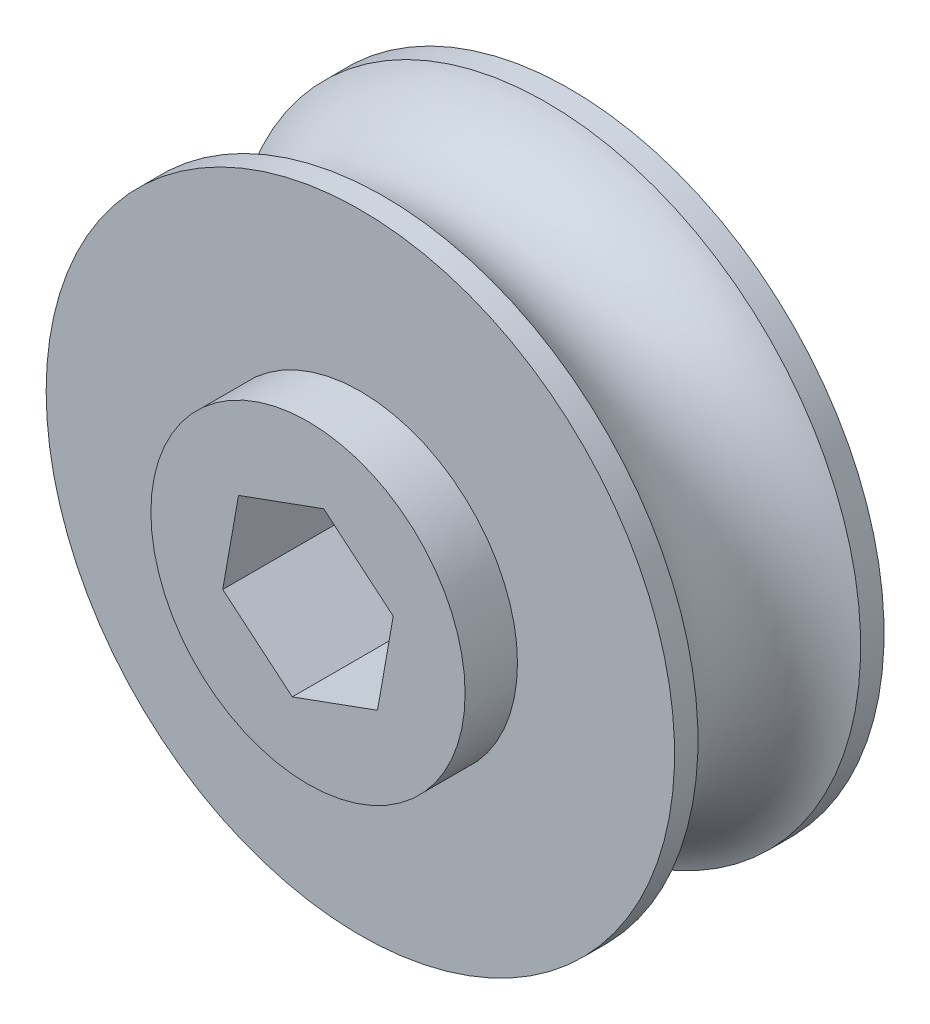
ISO-10303-21;
HEADER;
FILE_DESCRIPTION(('STEP AP214'),'2;1');
FILE_NAME('part.step','',(''),(''),'','','');
FILE_SCHEMA(('AUTOMOTIVE_DESIGN { 1 0 10303 214 1 1 1 1 }'));
ENDSEC;
DATA;
#1=APPLICATION_CONTEXT('core data for automotive mechanical design processes');
#2=APPLICATION_PROTOCOL_DEFINITION('international standard','automotive_design',2000,#1);
#3=PRODUCT_CONTEXT('',#1,'mechanical');
#4=PRODUCT('Part','Part','',(#3));
#5=PRODUCT_RELATED_PRODUCT_CATEGORY('part','',(#4));
#6=PRODUCT_DEFINITION_FORMATION('','',#4);
#7=PRODUCT_DEFINITION_CONTEXT('part definition',#1,'design');
#8=PRODUCT_DEFINITION('design','',#6,#7);
#9=PRODUCT_DEFINITION_SHAPE('','',#8);
#10=(LENGTH_UNIT() NAMED_UNIT(*) SI_UNIT(.MILLI.,.METRE.));
#11=(NAMED_UNIT(*) PLANE_ANGLE_UNIT() SI_UNIT($,.RADIAN.));
#12=(NAMED_UNIT(*) SI_UNIT($,.STERADIAN.) SOLID_ANGLE_UNIT());
#13=UNCERTAINTY_MEASURE_WITH_UNIT(LENGTH_MEASURE(1.E-05),#10,'distance_accuracy_value','');
#14=(GEOMETRIC_REPRESENTATION_CONTEXT(3) GLOBAL_UNCERTAINTY_ASSIGNED_CONTEXT((#13)) GLOBAL_UNIT_ASSIGNED_CONTEXT((#10,
#11,#12)) REPRESENTATION_CONTEXT('',''));
#15=CARTESIAN_POINT('',(0.,0.,0.));
#16=DIRECTION('',(0.,0.,1.));
#17=DIRECTION('',(1.,0.,0.));
#18=AXIS2_PLACEMENT_3D('',#15,#16,#17);
#19=CARTESIAN_POINT('',(0.,0.,15.875));
#20=DIRECTION('',(0.,0.,1.));
#21=DIRECTION('',(1.,0.,0.));
#22=AXIS2_PLACEMENT_3D('',#19,#20,#21);
#23=PLANE('',#22);
#24=DIRECTION('',(-0.173570076525815,-0.984821521157424,0.));
#25=VECTOR('',#24,1.);
#26=CARTESIAN_POINT('',(-5.16746609806817,-1.88126795680899,15.875));
#27=LINE('',#26,#25);
#28=CARTESIAN_POINT('',(-5.16746609806816,-1.88126795680899,15.875));
#29=VERTEX_POINT('',#28);
#30=CARTESIAN_POINT('',(-4.21295889095631,3.53452293571739,15.875));
#31=VERTEX_POINT('',#30);
#32=EDGE_CURVE('E116',#29,#31,#27,.F.);
#33=ORIENTED_EDGE('',*,*,#32,.T.);
#34=DIRECTION('',(-0.939665493778871,-0.342094664970547,0.));
#35=VECTOR('',#34,1.);
#36=CARTESIAN_POINT('',(-4.2129588909563,3.53452293571738,15.875));
#37=LINE('',#36,#35);
#38=CARTESIAN_POINT('',(0.954507207111848,5.41579089252637,15.875));
#39=VERTEX_POINT('',#38);
#40=EDGE_CURVE('E111',#31,#39,#37,.F.);
#41=ORIENTED_EDGE('',*,*,#40,.T.);
#42=DIRECTION('',(-0.766095417253056,0.642726856186877,0.));
#43=VECTOR('',#42,1.);
#44=CARTESIAN_POINT('',(0.954507207111846,5.41579089252637,15.875));
#45=LINE('',#44,#43);
#46=CARTESIAN_POINT('',(5.16746609806817,1.88126795680899,15.875));
#47=VERTEX_POINT('',#46);
#48=EDGE_CURVE('E73',#39,#47,#45,.F.);
#49=ORIENTED_EDGE('',*,*,#48,.T.);
#50=DIRECTION('',(0.173570076525816,0.984821521157424,0.));
#51=VECTOR('',#50,1.);
#52=CARTESIAN_POINT('',(5.16746609806817,1.88126795680899,15.875));
#53=LINE('',#52,#51);
#54=CARTESIAN_POINT('',(4.2129588909563,-3.53452293571739,15.875));
#55=VERTEX_POINT('',#54);
#56=EDGE_CURVE('E71',#47,#55,#53,.F.);
#57=ORIENTED_EDGE('',*,*,#56,.T.);
#58=DIRECTION('',(0.939665493778871,0.342094664970547,0.));
#59=VECTOR('',#58,1.);
#60=CARTESIAN_POINT('',(4.2129588909563,-3.53452293571738,15.875));
#61=LINE('',#60,#59);
#62=CARTESIAN_POINT('',(-0.95450720711185,-5.41579089252637,15.875));
#63=VERTEX_POINT('',#62);
#64=EDGE_CURVE('E68',#55,#63,#61,.F.);
#65=ORIENTED_EDGE('',*,*,#64,.T.);
#66=DIRECTION('',(0.766095417253055,-0.642726856186877,0.));
#67=VECTOR('',#66,1.);
#68=CARTESIAN_POINT('',(-0.954507207111849,-5.41579089252637,15.875));
#69=LINE('',#68,#67);
#70=EDGE_CURVE('E121',#63,#29,#69,.F.);
#71=ORIENTED_EDGE('',*,*,#70,.T.);
#72=EDGE_LOOP('',(#33,#41,#49,#57,#65,#71));
#73=FACE_BOUND('',#72,.T.);
#74=CARTESIAN_POINT('',(0.,0.,15.875));
#75=DIRECTION('',(0.,0.,-1.));
#76=DIRECTION('',(-1.,0.,0.));
#77=AXIS2_PLACEMENT_3D('',#74,#75,#76);
#78=CIRCLE('',#77,9.525);
#79=CARTESIAN_POINT('',(-9.525,0.,15.875));
#80=VERTEX_POINT('',#79);
#81=EDGE_CURVE('E20',#80,#80,#78,.T.);
#82=ORIENTED_EDGE('',*,*,#81,.F.);
#83=EDGE_LOOP('',(#82));
#84=FACE_BOUND('',#83,.T.);
#85=ADVANCED_FACE('F17',(#73,#84),#23,.T.);
#86=CARTESIAN_POINT('',(0.,0.,15.875));
#87=DIRECTION('',(0.,0.,-1.));
#88=DIRECTION('',(-1.,0.,0.));
#89=AXIS2_PLACEMENT_3D('',#86,#87,#88);
#90=CYLINDRICAL_SURFACE('',#89,9.525);
#91=CARTESIAN_POINT('',(0.,0.,12.7));
#92=DIRECTION('',(0.,0.,-1.));
#93=DIRECTION('',(-1.,0.,0.));
#94=AXIS2_PLACEMENT_3D('',#91,#92,#93);
#95=CIRCLE('',#94,9.525);
#96=CARTESIAN_POINT('',(-9.525,0.,12.7));
#97=VERTEX_POINT('',#96);
#98=EDGE_CURVE('E99',#97,#97,#95,.T.);
#99=ORIENTED_EDGE('',*,*,#98,.F.);
#100=EDGE_LOOP('',(#99));
#101=FACE_BOUND('',#100,.T.);
#102=ORIENTED_EDGE('',*,*,#81,.T.);
#103=EDGE_LOOP('',(#102));
#104=FACE_BOUND('',#103,.T.);
#105=ADVANCED_FACE('F182',(#101,#104),#90,.T.);
#106=CARTESIAN_POINT('',(5.16746609806817,1.88126795680899,15.875));
#107=DIRECTION('',(0.984821521157424,-0.173570076525816,0.));
#108=DIRECTION('',(0.173570076525816,0.984821521157424,0.));
#109=AXIS2_PLACEMENT_3D('',#106,#107,#108);
#110=PLANE('',#109);
#111=DIRECTION('',(0.,0.,1.));
#112=VECTOR('',#111,1.);
#113=CARTESIAN_POINT('',(4.2129588909563,-3.53452293571738,15.875));
#114=LINE('',#113,#112);
#115=CARTESIAN_POINT('',(4.2129588909563,-3.53452293571739,0.));
#116=VERTEX_POINT('',#115);
#117=EDGE_CURVE('E78',#116,#55,#114,.T.);
#118=ORIENTED_EDGE('',*,*,#117,.T.);
#119=ORIENTED_EDGE('',*,*,#56,.F.);
#120=DIRECTION('',(0.,0.,1.));
#121=VECTOR('',#120,1.);
#122=CARTESIAN_POINT('',(5.16746609806817,1.88126795680899,15.875));
#123=LINE('',#122,#121);
#124=CARTESIAN_POINT('',(5.16746609806817,1.88126795680899,0.));
#125=VERTEX_POINT('',#124);
#126=EDGE_CURVE('E101',#47,#125,#123,.F.);
#127=ORIENTED_EDGE('',*,*,#126,.T.);
#128=DIRECTION('',(-0.173570076525819,-0.984821521157423,0.));
#129=VECTOR('',#128,1.);
#130=CARTESIAN_POINT('',(5.16746609806817,1.88126795680899,0.));
#131=LINE('',#130,#129);
#132=EDGE_CURVE('E89',#125,#116,#131,.T.);
#133=ORIENTED_EDGE('',*,*,#132,.T.);
#134=EDGE_LOOP('',(#118,#119,#127,#133));
#135=FACE_BOUND('',#134,.T.);
#136=ADVANCED_FACE('F88',(#135),#110,.F.);
#137=CARTESIAN_POINT('',(4.2129588909563,-3.53452293571738,15.875));
#138=DIRECTION('',(0.342094664970547,-0.939665493778871,0.));
#139=DIRECTION('',(0.939665493778871,0.342094664970547,0.));
#140=AXIS2_PLACEMENT_3D('',#137,#138,#139);
#141=PLANE('',#140);
#142=DIRECTION('',(0.,0.,1.));
#143=VECTOR('',#142,1.);
#144=CARTESIAN_POINT('',(-0.954507207111849,-5.41579089252637,15.875));
#145=LINE('',#144,#143);
#146=CARTESIAN_POINT('',(-0.954507207111851,-5.41579089252637,0.));
#147=VERTEX_POINT('',#146);
#148=EDGE_CURVE('E85',#147,#63,#145,.T.);
#149=ORIENTED_EDGE('',*,*,#148,.T.);
#150=ORIENTED_EDGE('',*,*,#64,.F.);
#151=ORIENTED_EDGE('',*,*,#117,.F.);
#152=DIRECTION('',(-0.939665493778871,-0.342094664970547,0.));
#153=VECTOR('',#152,1.);
#154=CARTESIAN_POINT('',(4.2129588909563,-3.53452293571738,0.));
#155=LINE('',#154,#153);
#156=EDGE_CURVE('E104',#116,#147,#155,.T.);
#157=ORIENTED_EDGE('',*,*,#156,.T.);
#158=EDGE_LOOP('',(#149,#150,#151,#157));
#159=FACE_BOUND('',#158,.T.);
#160=ADVANCED_FACE('F82',(#159),#141,.F.);
#161=CARTESIAN_POINT('',(-0.954507207111849,-5.41579089252637,15.875));
#162=DIRECTION('',(-0.642726856186877,-0.766095417253055,0.));
#163=DIRECTION('',(0.766095417253055,-0.642726856186877,0.));
#164=AXIS2_PLACEMENT_3D('',#161,#162,#163);
#165=PLANE('',#164);
#166=DIRECTION('',(0.,0.,1.));
#167=VECTOR('',#166,1.);
#168=CARTESIAN_POINT('',(-5.16746609806817,-1.88126795680899,15.875));
#169=LINE('',#168,#167);
#170=CARTESIAN_POINT('',(-5.16746609806816,-1.88126795680899,0.));
#171=VERTEX_POINT('',#170);
#172=EDGE_CURVE('E118',#171,#29,#169,.T.);
#173=ORIENTED_EDGE('',*,*,#172,.T.);
#174=ORIENTED_EDGE('',*,*,#70,.F.);
#175=ORIENTED_EDGE('',*,*,#148,.F.);
#176=DIRECTION('',(-0.766095417253056,0.642726856186877,0.));
#177=VECTOR('',#176,1.);
#178=CARTESIAN_POINT('',(-0.954507207111849,-5.41579089252637,0.));
#179=LINE('',#178,#177);
#180=EDGE_CURVE('E132',#147,#171,#179,.T.);
#181=ORIENTED_EDGE('',*,*,#180,.T.);
#182=EDGE_LOOP('',(#173,#174,#175,#181));
#183=FACE_BOUND('',#182,.T.);
#184=ADVANCED_FACE('F130',(#183),#165,.F.);
#185=CARTESIAN_POINT('',(-5.16746609806817,-1.88126795680899,15.875));
#186=DIRECTION('',(-0.984821521157424,0.173570076525815,0.));
#187=DIRECTION('',(-0.173570076525815,-0.984821521157424,0.));
#188=AXIS2_PLACEMENT_3D('',#185,#186,#187);
#189=PLANE('',#188);
#190=DIRECTION('',(0.,0.,1.));
#191=VECTOR('',#190,1.);
#192=CARTESIAN_POINT('',(-4.2129588909563,3.53452293571738,15.875));
#193=LINE('',#192,#191);
#194=CARTESIAN_POINT('',(-4.21295889095631,3.53452293571739,0.));
#195=VERTEX_POINT('',#194);
#196=EDGE_CURVE('E113',#195,#31,#193,.T.);
#197=ORIENTED_EDGE('',*,*,#196,.T.);
#198=ORIENTED_EDGE('',*,*,#32,.F.);
#199=ORIENTED_EDGE('',*,*,#172,.F.);
#200=DIRECTION('',(0.173570076525819,0.984821521157423,0.));
#201=VECTOR('',#200,1.);
#202=CARTESIAN_POINT('',(-5.16746609806817,-1.88126795680899,0.));
#203=LINE('',#202,#201);
#204=EDGE_CURVE('E134',#171,#195,#203,.T.);
#205=ORIENTED_EDGE('',*,*,#204,.T.);
#206=EDGE_LOOP('',(#197,#198,#199,#205));
#207=FACE_BOUND('',#206,.T.);
#208=ADVANCED_FACE('F126',(#207),#189,.F.);
#209=CARTESIAN_POINT('',(-4.2129588909563,3.53452293571738,15.875));
#210=DIRECTION('',(-0.342094664970547,0.939665493778871,0.));
#211=DIRECTION('',(-0.939665493778871,-0.342094664970547,0.));
#212=AXIS2_PLACEMENT_3D('',#209,#210,#211);
#213=PLANE('',#212);
#214=DIRECTION('',(0.,0.,1.));
#215=VECTOR('',#214,1.);
#216=CARTESIAN_POINT('',(0.954507207111846,5.41579089252637,15.875));
#217=LINE('',#216,#215);
#218=CARTESIAN_POINT('',(0.954507207111848,5.41579089252637,0.));
#219=VERTEX_POINT('',#218);
#220=EDGE_CURVE('E35',#219,#39,#217,.T.);
#221=ORIENTED_EDGE('',*,*,#220,.T.);
#222=ORIENTED_EDGE('',*,*,#40,.F.);
#223=ORIENTED_EDGE('',*,*,#196,.F.);
#224=DIRECTION('',(0.939665493778871,0.342094664970548,0.));
#225=VECTOR('',#224,1.);
#226=CARTESIAN_POINT('',(-4.2129588909563,3.53452293571738,0.));
#227=LINE('',#226,#225);
#228=EDGE_CURVE('E136',#195,#219,#227,.T.);
#229=ORIENTED_EDGE('',*,*,#228,.T.);
#230=EDGE_LOOP('',(#221,#222,#223,#229));
#231=FACE_BOUND('',#230,.T.);
#232=ADVANCED_FACE('F171',(#231),#213,.F.);
#233=CARTESIAN_POINT('',(0.954507207111846,5.41579089252637,15.875));
#234=DIRECTION('',(0.642726856186877,0.766095417253056,0.));
#235=DIRECTION('',(-0.766095417253056,0.642726856186877,0.));
#236=AXIS2_PLACEMENT_3D('',#233,#234,#235);
#237=PLANE('',#236);
#238=ORIENTED_EDGE('',*,*,#126,.F.);
#239=ORIENTED_EDGE('',*,*,#48,.F.);
#240=ORIENTED_EDGE('',*,*,#220,.F.);
#241=DIRECTION('',(0.766095417253056,-0.642726856186877,0.));
#242=VECTOR('',#241,1.);
#243=CARTESIAN_POINT('',(0.954507207111846,5.41579089252637,0.));
#244=LINE('',#243,#242);
#245=EDGE_CURVE('E98',#219,#125,#244,.T.);
#246=ORIENTED_EDGE('',*,*,#245,.T.);
#247=EDGE_LOOP('',(#238,#239,#240,#246));
#248=FACE_BOUND('',#247,.T.);
#249=ADVANCED_FACE('F168',(#248),#237,.F.);
#250=CARTESIAN_POINT('',(0.,19.05,12.7));
#251=DIRECTION('',(0.,0.,1.));
#252=DIRECTION('',(1.,0.,0.));
#253=AXIS2_PLACEMENT_3D('',#250,#251,#252);
#254=PLANE('',#253);
#255=ORIENTED_EDGE('',*,*,#98,.T.);
#256=EDGE_LOOP('',(#255));
#257=FACE_BOUND('',#256,.T.);
#258=CARTESIAN_POINT('',(0.,0.,12.7));
#259=DIRECTION('',(0.,0.,-1.));
#260=DIRECTION('',(-1.,0.,0.));
#261=AXIS2_PLACEMENT_3D('',#258,#259,#260);
#262=CIRCLE('',#261,19.05);
#263=CARTESIAN_POINT('',(-19.05,0.,12.7));
#264=VERTEX_POINT('',#263);
#265=EDGE_CURVE('E96',#264,#264,#262,.T.);
#266=ORIENTED_EDGE('',*,*,#265,.F.);
#267=EDGE_LOOP('',(#266));
#268=FACE_BOUND('',#267,.T.);
#269=ADVANCED_FACE('F165',(#257,#268),#254,.T.);
#270=CARTESIAN_POINT('',(0.,0.,0.));
#271=DIRECTION('',(0.,0.,1.));
#272=DIRECTION('',(1.,0.,0.));
#273=AXIS2_PLACEMENT_3D('',#270,#271,#272);
#274=PLANE('',#273);
#275=ORIENTED_EDGE('',*,*,#228,.F.);
#276=ORIENTED_EDGE('',*,*,#204,.F.);
#277=ORIENTED_EDGE('',*,*,#180,.F.);
#278=ORIENTED_EDGE('',*,*,#156,.F.);
#279=ORIENTED_EDGE('',*,*,#132,.F.);
#280=ORIENTED_EDGE('',*,*,#245,.F.);
#281=EDGE_LOOP('',(#275,#276,#277,#278,#279,#280));
#282=FACE_BOUND('',#281,.T.);
#283=CARTESIAN_POINT('',(0.,0.,0.));
#284=DIRECTION('',(0.,0.,-1.));
#285=DIRECTION('',(-1.,0.,0.));
#286=AXIS2_PLACEMENT_3D('',#283,#284,#285);
#287=CIRCLE('',#286,19.05);
#288=CARTESIAN_POINT('',(-19.05,0.,0.));
#289=VERTEX_POINT('',#288);
#290=EDGE_CURVE('E93',#289,#289,#287,.F.);
#291=ORIENTED_EDGE('',*,*,#290,.F.);
#292=EDGE_LOOP('',(#291));
#293=FACE_BOUND('',#292,.T.);
#294=ADVANCED_FACE('F161',(#282,#293),#274,.F.);
#295=CARTESIAN_POINT('',(0.,0.,11.9908939555463));
#296=DIRECTION('',(0.,0.,-1.));
#297=DIRECTION('',(-1.,0.,0.));
#298=AXIS2_PLACEMENT_3D('',#295,#296,#297);
#299=CYLINDRICAL_SURFACE('',#298,19.05);
#300=CARTESIAN_POINT('',(0.,0.,11.2817879110927));
#301=DIRECTION('',(0.,0.,-1.));
#302=DIRECTION('',(-1.,0.,0.));
#303=AXIS2_PLACEMENT_3D('',#300,#301,#302);
#304=CIRCLE('',#303,19.05);
#305=CARTESIAN_POINT('',(-19.05,0.,11.2817879110927));
#306=VERTEX_POINT('',#305);
#307=EDGE_CURVE('E26',#306,#306,#304,.F.);
#308=ORIENTED_EDGE('',*,*,#307,.T.);
#309=EDGE_LOOP('',(#308));
#310=FACE_BOUND('',#309,.T.);
#311=ORIENTED_EDGE('',*,*,#265,.T.);
#312=EDGE_LOOP('',(#311));
#313=FACE_BOUND('',#312,.T.);
#314=ADVANCED_FACE('F157',(#310,#313),#299,.T.);
#315=CARTESIAN_POINT('',(0.,0.,0.709106044453655));
#316=DIRECTION('',(0.,0.,-1.));
#317=DIRECTION('',(-1.,0.,0.));
#318=AXIS2_PLACEMENT_3D('',#315,#316,#317);
#319=CYLINDRICAL_SURFACE('',#318,19.05);
#320=ORIENTED_EDGE('',*,*,#290,.T.);
#321=EDGE_LOOP('',(#320));
#322=FACE_BOUND('',#321,.T.);
#323=CARTESIAN_POINT('',(0.,0.,1.41821208890731));
#324=DIRECTION('',(0.,0.,-1.));
#325=DIRECTION('',(-1.,0.,0.));
#326=AXIS2_PLACEMENT_3D('',#323,#324,#325);
#327=CIRCLE('',#326,19.05);
#328=CARTESIAN_POINT('',(-19.05,0.,1.41821208890731));
#329=VERTEX_POINT('',#328);
#330=EDGE_CURVE('E11',#329,#329,#327,.T.);
#331=ORIENTED_EDGE('',*,*,#330,.T.);
#332=EDGE_LOOP('',(#331));
#333=FACE_BOUND('',#332,.T.);
#334=ADVANCED_FACE('F153',(#322,#333),#319,.T.);
#335=CARTESIAN_POINT('',(0.,0.,6.35));
#336=DIRECTION('',(0.,0.,-1.));
#337=DIRECTION('',(-1.,0.,0.));
#338=AXIS2_PLACEMENT_3D('',#335,#336,#337);
#339=TOROIDAL_SURFACE('',#338,21.082,5.334);
#340=ORIENTED_EDGE('',*,*,#330,.F.);
#341=EDGE_LOOP('',(#340));
#342=FACE_BOUND('',#341,.T.);
#343=ORIENTED_EDGE('',*,*,#307,.F.);
#344=EDGE_LOOP('',(#343));
#345=FACE_BOUND('',#344,.T.);
#346=ADVANCED_FACE('F150',(#342,#345),#339,.F.);
#347=CLOSED_SHELL('',(#85,#105,#136,#160,#184,#208,#232,#249,#269,#294,#314,#334,#346));
#348=MANIFOLD_SOLID_BREP('B1',#347);
#349=ADVANCED_BREP_SHAPE_REPRESENTATION('',(#18,#348),#14);
#350=SHAPE_DEFINITION_REPRESENTATION(#9,#349);
ENDSEC;
END-ISO-10303-21;
